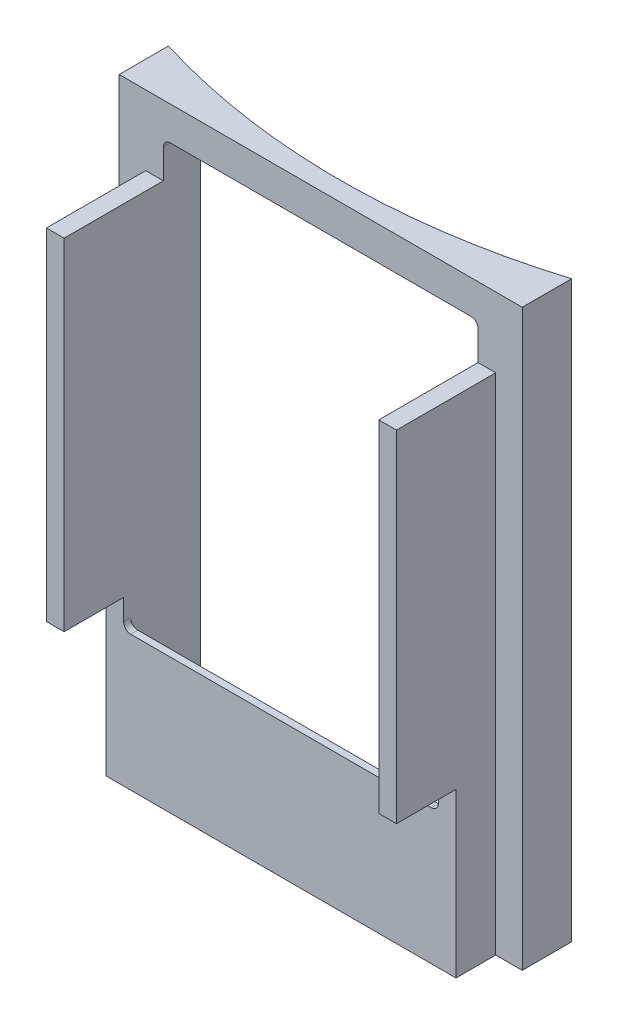
ISO-10303-21;
HEADER;
FILE_DESCRIPTION(('STEP AP214'),'2;1');
FILE_NAME('part.step','',(''),(''),'','','');
FILE_SCHEMA(('AUTOMOTIVE_DESIGN { 1 0 10303 214 1 1 1 1 }'));
ENDSEC;
DATA;
#1=APPLICATION_CONTEXT('core data for automotive mechanical design processes');
#2=APPLICATION_PROTOCOL_DEFINITION('international standard','automotive_design',2000,#1);
#3=PRODUCT_CONTEXT('',#1,'mechanical');
#4=PRODUCT('Part','Part','',(#3));
#5=PRODUCT_RELATED_PRODUCT_CATEGORY('part','',(#4));
#6=PRODUCT_DEFINITION_FORMATION('','',#4);
#7=PRODUCT_DEFINITION_CONTEXT('part definition',#1,'design');
#8=PRODUCT_DEFINITION('design','',#6,#7);
#9=PRODUCT_DEFINITION_SHAPE('','',#8);
#10=(LENGTH_UNIT() NAMED_UNIT(*) SI_UNIT(.MILLI.,.METRE.));
#11=(NAMED_UNIT(*) PLANE_ANGLE_UNIT() SI_UNIT($,.RADIAN.));
#12=(NAMED_UNIT(*) SI_UNIT($,.STERADIAN.) SOLID_ANGLE_UNIT());
#13=UNCERTAINTY_MEASURE_WITH_UNIT(LENGTH_MEASURE(1.E-05),#10,'distance_accuracy_value','');
#14=(GEOMETRIC_REPRESENTATION_CONTEXT(3) GLOBAL_UNCERTAINTY_ASSIGNED_CONTEXT((#13)) GLOBAL_UNIT_ASSIGNED_CONTEXT((#10,
#11,#12)) REPRESENTATION_CONTEXT('',''));
#15=CARTESIAN_POINT('',(0.,0.,0.));
#16=DIRECTION('',(0.,0.,1.));
#17=DIRECTION('',(1.,0.,0.));
#18=AXIS2_PLACEMENT_3D('',#15,#16,#17);
#19=CARTESIAN_POINT('',(-37.465,-119.888,288.06938));
#20=DIRECTION('',(0.,0.,1.));
#21=DIRECTION('',(1.,0.,0.));
#22=AXIS2_PLACEMENT_3D('',#19,#20,#21);
#23=PLANE('',#22);
#24=DIRECTION('',(0.,-1.,0.));
#25=VECTOR('',#24,1.);
#26=CARTESIAN_POINT('',(-37.465,76.835,288.06938));
#27=LINE('',#26,#25);
#28=CARTESIAN_POINT('',(-37.465,61.211000006,288.06938));
#29=VERTEX_POINT('',#28);
#30=CARTESIAN_POINT('',(-37.465,-61.211000006,288.06938));
#31=VERTEX_POINT('',#30);
#32=EDGE_CURVE('E510',#29,#31,#27,.T.);
#33=ORIENTED_EDGE('',*,*,#32,.T.);
#34=DIRECTION('',(1.,0.,0.));
#35=VECTOR('',#34,1.);
#36=CARTESIAN_POINT('',(-37.465,-61.211000006,288.06938));
#37=LINE('',#36,#35);
#38=CARTESIAN_POINT('',(-31.115,-61.211000006,288.06938));
#39=VERTEX_POINT('',#38);
#40=EDGE_CURVE('E225',#31,#39,#37,.T.);
#41=ORIENTED_EDGE('',*,*,#40,.T.);
#42=DIRECTION('',(0.,1.,0.));
#43=VECTOR('',#42,1.);
#44=CARTESIAN_POINT('',(-31.115,-119.888,288.06938));
#45=LINE('',#44,#43);
#46=CARTESIAN_POINT('',(-31.115,61.211000006,288.06938));
#47=VERTEX_POINT('',#46);
#48=EDGE_CURVE('E410',#39,#47,#45,.T.);
#49=ORIENTED_EDGE('',*,*,#48,.T.);
#50=DIRECTION('',(1.,0.,0.));
#51=VECTOR('',#50,1.);
#52=CARTESIAN_POINT('',(-37.465,61.211000006,288.06938));
#53=LINE('',#52,#51);
#54=EDGE_CURVE('E270',#29,#47,#53,.T.);
#55=ORIENTED_EDGE('',*,*,#54,.F.);
#56=EDGE_LOOP('',(#33,#41,#49,#55));
#57=FACE_BOUND('',#56,.T.);
#58=ADVANCED_FACE('F35',(#57),#23,.T.);
#59=DIRECTION('',(0.,-1.,0.));
#60=VECTOR('',#59,1.);
#61=CARTESIAN_POINT('',(81.9149999999999,-119.888,288.06938));
#62=LINE('',#61,#60);
#63=CARTESIAN_POINT('',(81.915,61.211000006,288.06938));
#64=VERTEX_POINT('',#63);
#65=CARTESIAN_POINT('',(81.915,-61.211000006,288.06938));
#66=VERTEX_POINT('',#65);
#67=EDGE_CURVE('E482',#64,#66,#62,.T.);
#68=ORIENTED_EDGE('',*,*,#67,.T.);
#69=CARTESIAN_POINT('',(88.265,-61.211000006,288.06938));
#70=VERTEX_POINT('',#69);
#71=EDGE_CURVE('E246',#66,#70,#37,.T.);
#72=ORIENTED_EDGE('',*,*,#71,.T.);
#73=DIRECTION('',(0.,1.,0.));
#74=VECTOR('',#73,1.);
#75=CARTESIAN_POINT('',(88.265,76.835,288.06938));
#76=LINE('',#75,#74);
#77=CARTESIAN_POINT('',(88.265,61.211000006,288.06938));
#78=VERTEX_POINT('',#77);
#79=EDGE_CURVE('E462',#70,#78,#76,.T.);
#80=ORIENTED_EDGE('',*,*,#79,.T.);
#81=EDGE_CURVE('E266',#64,#78,#53,.T.);
#82=ORIENTED_EDGE('',*,*,#81,.F.);
#83=EDGE_LOOP('',(#68,#72,#80,#82));
#84=FACE_BOUND('',#83,.T.);
#85=ADVANCED_FACE('F371',(#84),#23,.T.);
#86=CARTESIAN_POINT('',(-31.115,-71.374,294.5052));
#87=DIRECTION('',(0.,1.,0.));
#88=DIRECTION('',(0.,0.,1.));
#89=AXIS2_PLACEMENT_3D('',#86,#87,#88);
#90=PLANE('',#89);
#91=DIRECTION('',(-1.,0.,0.));
#92=VECTOR('',#91,1.);
#93=CARTESIAN_POINT('',(-31.115,-71.374,266.7));
#94=LINE('',#93,#92);
#95=CARTESIAN_POINT('',(79.375,-71.374,266.7));
#96=VERTEX_POINT('',#95);
#97=CARTESIAN_POINT('',(-28.575,-71.374,266.7));
#98=VERTEX_POINT('',#97);
#99=EDGE_CURVE('E239',#96,#98,#94,.T.);
#100=ORIENTED_EDGE('',*,*,#99,.F.);
#101=DIRECTION('',(0.,0.,-1.));
#102=VECTOR('',#101,1.);
#103=CARTESIAN_POINT('',(79.375,-71.374,264.16));
#104=LINE('',#103,#102);
#105=CARTESIAN_POINT('',(79.375,-71.374,264.16));
#106=VERTEX_POINT('',#105);
#107=EDGE_CURVE('E437',#96,#106,#104,.T.);
#108=ORIENTED_EDGE('',*,*,#107,.T.);
#109=DIRECTION('',(1.,0.,0.));
#110=VECTOR('',#109,1.);
#111=CARTESIAN_POINT('',(81.915,-71.374,264.16));
#112=LINE('',#111,#110);
#113=CARTESIAN_POINT('',(-28.575,-71.374,264.16));
#114=VERTEX_POINT('',#113);
#115=EDGE_CURVE('E458',#114,#106,#112,.T.);
#116=ORIENTED_EDGE('',*,*,#115,.F.);
#117=DIRECTION('',(0.,0.,-1.));
#118=VECTOR('',#117,1.);
#119=CARTESIAN_POINT('',(-28.575,-71.374,288.06938));
#120=LINE('',#119,#118);
#121=EDGE_CURVE('E434',#114,#98,#120,.F.);
#122=ORIENTED_EDGE('',*,*,#121,.T.);
#123=EDGE_LOOP('',(#100,#108,#116,#122));
#124=FACE_BOUND('',#123,.T.);
#125=ADVANCED_FACE('F346',(#124),#90,.T.);
#126=CARTESIAN_POINT('',(-46.99,86.36,252.4252));
#127=DIRECTION('',(1.,0.,0.));
#128=DIRECTION('',(0.,1.,0.));
#129=AXIS2_PLACEMENT_3D('',#126,#127,#128);
#130=PLANE('',#129);
#131=DIRECTION('',(0.,0.,-1.));
#132=VECTOR('',#131,1.);
#133=CARTESIAN_POINT('',(-46.99,86.36,252.4252));
#134=LINE('',#133,#132);
#135=CARTESIAN_POINT('',(-46.99,86.36,252.4252));
#136=VERTEX_POINT('',#135);
#137=CARTESIAN_POINT('',(-46.99,86.36,234.708094926443));
#138=VERTEX_POINT('',#137);
#139=EDGE_CURVE('E489',#136,#138,#134,.T.);
#140=ORIENTED_EDGE('',*,*,#139,.T.);
#141=DIRECTION('',(0.,1.,0.));
#142=VECTOR('',#141,1.);
#143=CARTESIAN_POINT('',(-46.99,-143.64,234.708094926443));
#144=LINE('',#143,#142);
#145=CARTESIAN_POINT('',(-46.99,-119.888,234.708094926443));
#146=VERTEX_POINT('',#145);
#147=EDGE_CURVE('E540',#138,#146,#144,.F.);
#148=ORIENTED_EDGE('',*,*,#147,.T.);
#149=DIRECTION('',(0.,0.,-1.));
#150=VECTOR('',#149,1.);
#151=CARTESIAN_POINT('',(-46.99,-119.888,252.4252));
#152=LINE('',#151,#150);
#153=CARTESIAN_POINT('',(-46.99,-119.888,252.4252));
#154=VERTEX_POINT('',#153);
#155=EDGE_CURVE('E479',#154,#146,#152,.T.);
#156=ORIENTED_EDGE('',*,*,#155,.F.);
#157=DIRECTION('',(0.,-1.,0.));
#158=VECTOR('',#157,1.);
#159=CARTESIAN_POINT('',(-46.99,86.36,252.4252));
#160=LINE('',#159,#158);
#161=EDGE_CURVE('E464',#136,#154,#160,.T.);
#162=ORIENTED_EDGE('',*,*,#161,.F.);
#163=EDGE_LOOP('',(#140,#148,#156,#162));
#164=FACE_BOUND('',#163,.T.);
#165=ADVANCED_FACE('F342',(#164),#130,.F.);
#166=CARTESIAN_POINT('',(-46.99,-119.888,252.4252));
#167=DIRECTION('',(0.,1.,0.));
#168=DIRECTION('',(0.,0.,1.));
#169=AXIS2_PLACEMENT_3D('',#166,#167,#168);
#170=PLANE('',#169);
#171=DIRECTION('',(0.,0.,-1.));
#172=VECTOR('',#171,1.);
#173=CARTESIAN_POINT('',(88.265,-119.888,288.06938));
#174=LINE('',#173,#172);
#175=CARTESIAN_POINT('',(88.265,-119.888,266.7));
#176=VERTEX_POINT('',#175);
#177=CARTESIAN_POINT('',(88.265,-119.888,252.4252));
#178=VERTEX_POINT('',#177);
#179=EDGE_CURVE('E508',#176,#178,#174,.T.);
#180=ORIENTED_EDGE('',*,*,#179,.F.);
#181=DIRECTION('',(1.,0.,0.));
#182=VECTOR('',#181,1.);
#183=CARTESIAN_POINT('',(-37.465,-119.888,266.7));
#184=LINE('',#183,#182);
#185=CARTESIAN_POINT('',(-37.465,-119.888,266.7));
#186=VERTEX_POINT('',#185);
#187=EDGE_CURVE('E58',#186,#176,#184,.T.);
#188=ORIENTED_EDGE('',*,*,#187,.F.);
#189=DIRECTION('',(0.,0.,-1.));
#190=VECTOR('',#189,1.);
#191=CARTESIAN_POINT('',(-37.465,-119.888,288.06938));
#192=LINE('',#191,#190);
#193=CARTESIAN_POINT('',(-37.465,-119.888,252.4252));
#194=VERTEX_POINT('',#193);
#195=EDGE_CURVE('E215',#186,#194,#192,.T.);
#196=ORIENTED_EDGE('',*,*,#195,.T.);
#197=DIRECTION('',(1.,0.,0.));
#198=VECTOR('',#197,1.);
#199=CARTESIAN_POINT('',(-46.99,-119.888,252.4252));
#200=LINE('',#199,#198);
#201=EDGE_CURVE('E476',#154,#194,#200,.T.);
#202=ORIENTED_EDGE('',*,*,#201,.F.);
#203=ORIENTED_EDGE('',*,*,#155,.T.);
#204=CARTESIAN_POINT('',(25.4,-119.888,0.));
#205=DIRECTION('',(0.,1.,0.));
#206=DIRECTION('',(0.,0.,1.));
#207=AXIS2_PLACEMENT_3D('',#204,#205,#206);
#208=CIRCLE('',#207,245.618);
#209=CARTESIAN_POINT('',(97.79,-119.888,234.708094926443));
#210=VERTEX_POINT('',#209);
#211=EDGE_CURVE('E544',#146,#210,#208,.T.);
#212=ORIENTED_EDGE('',*,*,#211,.T.);
#213=DIRECTION('',(0.,0.,-1.));
#214=VECTOR('',#213,1.);
#215=CARTESIAN_POINT('',(97.79,-119.888,252.4252));
#216=LINE('',#215,#214);
#217=CARTESIAN_POINT('',(97.79,-119.888,252.4252));
#218=VERTEX_POINT('',#217);
#219=EDGE_CURVE('E483',#218,#210,#216,.T.);
#220=ORIENTED_EDGE('',*,*,#219,.F.);
#221=EDGE_CURVE('E467',#178,#218,#200,.T.);
#222=ORIENTED_EDGE('',*,*,#221,.F.);
#223=EDGE_LOOP('',(#180,#188,#196,#202,#203,#212,#220,#222));
#224=FACE_BOUND('',#223,.T.);
#225=ADVANCED_FACE('F345',(#224),#170,.F.);
#226=CARTESIAN_POINT('',(97.79,86.36,252.4252));
#227=DIRECTION('',(-1.,0.,0.));
#228=DIRECTION('',(0.,-1.,0.));
#229=AXIS2_PLACEMENT_3D('',#226,#227,#228);
#230=PLANE('',#229);
#231=ORIENTED_EDGE('',*,*,#219,.T.);
#232=DIRECTION('',(0.,1.,0.));
#233=VECTOR('',#232,1.);
#234=CARTESIAN_POINT('',(97.79,-143.64,234.708094926443));
#235=LINE('',#234,#233);
#236=CARTESIAN_POINT('',(97.79,86.36,234.708094926443));
#237=VERTEX_POINT('',#236);
#238=EDGE_CURVE('E330',#210,#237,#235,.T.);
#239=ORIENTED_EDGE('',*,*,#238,.T.);
#240=DIRECTION('',(0.,0.,-1.));
#241=VECTOR('',#240,1.);
#242=CARTESIAN_POINT('',(97.79,86.36,252.4252));
#243=LINE('',#242,#241);
#244=CARTESIAN_POINT('',(97.79,86.36,252.4252));
#245=VERTEX_POINT('',#244);
#246=EDGE_CURVE('E486',#245,#237,#243,.T.);
#247=ORIENTED_EDGE('',*,*,#246,.F.);
#248=DIRECTION('',(0.,1.,0.));
#249=VECTOR('',#248,1.);
#250=CARTESIAN_POINT('',(97.79,86.36,252.4252));
#251=LINE('',#250,#249);
#252=EDGE_CURVE('E470',#218,#245,#251,.T.);
#253=ORIENTED_EDGE('',*,*,#252,.F.);
#254=EDGE_LOOP('',(#231,#239,#247,#253));
#255=FACE_BOUND('',#254,.T.);
#256=ADVANCED_FACE('F350',(#255),#230,.F.);
#257=CARTESIAN_POINT('',(-46.99,86.36,252.4252));
#258=DIRECTION('',(0.,-1.,0.));
#259=DIRECTION('',(0.,0.,-1.));
#260=AXIS2_PLACEMENT_3D('',#257,#258,#259);
#261=PLANE('',#260);
#262=ORIENTED_EDGE('',*,*,#246,.T.);
#263=CARTESIAN_POINT('',(25.4,86.36,0.));
#264=DIRECTION('',(0.,1.,0.));
#265=DIRECTION('',(0.,0.,1.));
#266=AXIS2_PLACEMENT_3D('',#263,#264,#265);
#267=CIRCLE('',#266,245.618);
#268=EDGE_CURVE('E277',#138,#237,#267,.T.);
#269=ORIENTED_EDGE('',*,*,#268,.F.);
#270=ORIENTED_EDGE('',*,*,#139,.F.);
#271=DIRECTION('',(-1.,0.,0.));
#272=VECTOR('',#271,1.);
#273=CARTESIAN_POINT('',(-46.99,86.36,252.4252));
#274=LINE('',#273,#272);
#275=EDGE_CURVE('E491',#245,#136,#274,.T.);
#276=ORIENTED_EDGE('',*,*,#275,.F.);
#277=EDGE_LOOP('',(#262,#269,#270,#276));
#278=FACE_BOUND('',#277,.T.);
#279=ADVANCED_FACE('F354',(#278),#261,.F.);
#280=CARTESIAN_POINT('',(-46.99,-119.888,252.4252));
#281=DIRECTION('',(0.,0.,1.));
#282=DIRECTION('',(1.,0.,0.));
#283=AXIS2_PLACEMENT_3D('',#280,#281,#282);
#284=PLANE('',#283);
#285=DIRECTION('',(0.,-1.,0.));
#286=VECTOR('',#285,1.);
#287=CARTESIAN_POINT('',(-37.465,76.835,252.4252));
#288=LINE('',#287,#286);
#289=CARTESIAN_POINT('',(-37.465,61.211000006,252.4252));
#290=VERTEX_POINT('',#289);
#291=EDGE_CURVE('E455',#290,#194,#288,.T.);
#292=ORIENTED_EDGE('',*,*,#291,.F.);
#293=DIRECTION('',(-1.,0.,0.));
#294=VECTOR('',#293,1.);
#295=CARTESIAN_POINT('',(-44.4776568299334,61.211000006,252.4252));
#296=LINE('',#295,#294);
#297=CARTESIAN_POINT('',(-31.115,61.211000006,252.4252));
#298=VERTEX_POINT('',#297);
#299=EDGE_CURVE('E254',#298,#290,#296,.T.);
#300=ORIENTED_EDGE('',*,*,#299,.F.);
#301=DIRECTION('',(0.,1.,0.));
#302=VECTOR('',#301,1.);
#303=CARTESIAN_POINT('',(-31.115,71.374,252.4252));
#304=LINE('',#303,#302);
#305=CARTESIAN_POINT('',(-31.115,71.755,252.4252));
#306=VERTEX_POINT('',#305);
#307=EDGE_CURVE('E264',#298,#306,#304,.T.);
#308=ORIENTED_EDGE('',*,*,#307,.T.);
#309=CARTESIAN_POINT('',(-28.575,71.755,252.4252));
#310=DIRECTION('',(0.,0.,-1.));
#311=DIRECTION('',(-1.,0.,0.));
#312=AXIS2_PLACEMENT_3D('',#309,#310,#311);
#313=CIRCLE('',#312,2.54);
#314=CARTESIAN_POINT('',(-28.575,74.295,252.4252));
#315=VERTEX_POINT('',#314);
#316=EDGE_CURVE('E261',#315,#306,#313,.F.);
#317=ORIENTED_EDGE('',*,*,#316,.F.);
#318=DIRECTION('',(-1.,0.,0.));
#319=VECTOR('',#318,1.);
#320=CARTESIAN_POINT('',(81.915,74.295,252.4252));
#321=LINE('',#320,#319);
#322=CARTESIAN_POINT('',(79.375,74.295,252.4252));
#323=VERTEX_POINT('',#322);
#324=EDGE_CURVE('E50',#323,#315,#321,.T.);
#325=ORIENTED_EDGE('',*,*,#324,.F.);
#326=CARTESIAN_POINT('',(79.375,71.755,252.4252));
#327=DIRECTION('',(0.,0.,-1.));
#328=DIRECTION('',(-1.,0.,0.));
#329=AXIS2_PLACEMENT_3D('',#326,#327,#328);
#330=CIRCLE('',#329,2.54);
#331=CARTESIAN_POINT('',(81.915,71.755,252.4252));
#332=VERTEX_POINT('',#331);
#333=EDGE_CURVE('E447',#332,#323,#330,.F.);
#334=ORIENTED_EDGE('',*,*,#333,.F.);
#335=DIRECTION('',(0.,-1.,0.));
#336=VECTOR('',#335,1.);
#337=CARTESIAN_POINT('',(81.915,71.374,252.4252));
#338=LINE('',#337,#336);
#339=CARTESIAN_POINT('',(81.915,61.211000006,252.4252));
#340=VERTEX_POINT('',#339);
#341=EDGE_CURVE('E259',#332,#340,#338,.T.);
#342=ORIENTED_EDGE('',*,*,#341,.T.);
#343=CARTESIAN_POINT('',(88.265,61.211000006,252.4252));
#344=VERTEX_POINT('',#343);
#345=EDGE_CURVE('E255',#344,#340,#296,.T.);
#346=ORIENTED_EDGE('',*,*,#345,.F.);
#347=DIRECTION('',(0.,1.,0.));
#348=VECTOR('',#347,1.);
#349=CARTESIAN_POINT('',(88.265,76.835,252.4252));
#350=LINE('',#349,#348);
#351=EDGE_CURVE('E457',#178,#344,#350,.T.);
#352=ORIENTED_EDGE('',*,*,#351,.F.);
#353=ORIENTED_EDGE('',*,*,#221,.T.);
#354=ORIENTED_EDGE('',*,*,#252,.T.);
#355=ORIENTED_EDGE('',*,*,#275,.T.);
#356=ORIENTED_EDGE('',*,*,#161,.T.);
#357=ORIENTED_EDGE('',*,*,#201,.T.);
#358=EDGE_LOOP('',(#292,#300,#308,#317,#325,#334,#342,#346,#352,#353,#354,#355,#356,#357));
#359=FACE_BOUND('',#358,.T.);
#360=ADVANCED_FACE('F358',(#359),#284,.T.);
#361=CARTESIAN_POINT('',(-37.465,76.835,288.06938));
#362=DIRECTION('',(1.,0.,0.));
#363=DIRECTION('',(0.,1.,0.));
#364=AXIS2_PLACEMENT_3D('',#361,#362,#363);
#365=PLANE('',#364);
#366=DIRECTION('',(0.,-1.,0.));
#367=VECTOR('',#366,1.);
#368=CARTESIAN_POINT('',(-37.465,-119.888,266.7));
#369=LINE('',#368,#367);
#370=CARTESIAN_POINT('',(-37.465,-61.211000006,266.7));
#371=VERTEX_POINT('',#370);
#372=EDGE_CURVE('E208',#371,#186,#369,.T.);
#373=ORIENTED_EDGE('',*,*,#372,.F.);
#374=DIRECTION('',(0.,0.,-1.));
#375=VECTOR('',#374,1.);
#376=CARTESIAN_POINT('',(-37.465,-61.211000006,288.06938));
#377=LINE('',#376,#375);
#378=EDGE_CURVE('E212',#31,#371,#377,.T.);
#379=ORIENTED_EDGE('',*,*,#378,.F.);
#380=ORIENTED_EDGE('',*,*,#32,.F.);
#381=DIRECTION('',(0.,0.,-1.));
#382=VECTOR('',#381,1.);
#383=CARTESIAN_POINT('',(-37.465,61.211000006,288.06938));
#384=LINE('',#383,#382);
#385=EDGE_CURVE('E217',#29,#290,#384,.T.);
#386=ORIENTED_EDGE('',*,*,#385,.T.);
#387=ORIENTED_EDGE('',*,*,#291,.T.);
#388=ORIENTED_EDGE('',*,*,#195,.F.);
#389=EDGE_LOOP('',(#373,#379,#380,#386,#387,#388));
#390=FACE_BOUND('',#389,.T.);
#391=ADVANCED_FACE('F210',(#390),#365,.F.);
#392=CARTESIAN_POINT('',(88.265,76.835,288.06938));
#393=DIRECTION('',(-1.,0.,0.));
#394=DIRECTION('',(0.,-1.,0.));
#395=AXIS2_PLACEMENT_3D('',#392,#393,#394);
#396=PLANE('',#395);
#397=DIRECTION('',(0.,0.,1.));
#398=VECTOR('',#397,1.);
#399=CARTESIAN_POINT('',(88.265,-61.211000006,288.06938));
#400=LINE('',#399,#398);
#401=CARTESIAN_POINT('',(88.265,-61.211000006,266.7));
#402=VERTEX_POINT('',#401);
#403=EDGE_CURVE('E249',#402,#70,#400,.T.);
#404=ORIENTED_EDGE('',*,*,#403,.F.);
#405=DIRECTION('',(0.,1.,0.));
#406=VECTOR('',#405,1.);
#407=CARTESIAN_POINT('',(88.265,-119.888,266.7));
#408=LINE('',#407,#406);
#409=EDGE_CURVE('E275',#176,#402,#408,.T.);
#410=ORIENTED_EDGE('',*,*,#409,.F.);
#411=ORIENTED_EDGE('',*,*,#179,.T.);
#412=ORIENTED_EDGE('',*,*,#351,.T.);
#413=DIRECTION('',(0.,0.,-1.));
#414=VECTOR('',#413,1.);
#415=CARTESIAN_POINT('',(88.265,61.211000006,292.15726668321));
#416=LINE('',#415,#414);
#417=EDGE_CURVE('E226',#78,#344,#416,.T.);
#418=ORIENTED_EDGE('',*,*,#417,.F.);
#419=ORIENTED_EDGE('',*,*,#79,.F.);
#420=EDGE_LOOP('',(#404,#410,#411,#412,#418,#419));
#421=FACE_BOUND('',#420,.T.);
#422=ADVANCED_FACE('F364',(#421),#396,.F.);
#423=CARTESIAN_POINT('',(-31.115,71.374,294.5052));
#424=DIRECTION('',(1.,0.,0.));
#425=DIRECTION('',(0.,1.,0.));
#426=AXIS2_PLACEMENT_3D('',#423,#424,#425);
#427=PLANE('',#426);
#428=DIRECTION('',(0.,1.,0.));
#429=VECTOR('',#428,1.);
#430=CARTESIAN_POINT('',(-31.115,71.374,266.7));
#431=LINE('',#430,#429);
#432=CARTESIAN_POINT('',(-31.115,-68.834,266.7));
#433=VERTEX_POINT('',#432);
#434=CARTESIAN_POINT('',(-31.115,-61.211000006,266.7));
#435=VERTEX_POINT('',#434);
#436=EDGE_CURVE('E230',#433,#435,#431,.T.);
#437=ORIENTED_EDGE('',*,*,#436,.F.);
#438=DIRECTION('',(0.,0.,-1.));
#439=VECTOR('',#438,1.);
#440=CARTESIAN_POINT('',(-31.115,-68.834,264.16));
#441=LINE('',#440,#439);
#442=CARTESIAN_POINT('',(-31.115,-68.834,264.16));
#443=VERTEX_POINT('',#442);
#444=EDGE_CURVE('E421',#433,#443,#441,.T.);
#445=ORIENTED_EDGE('',*,*,#444,.T.);
#446=DIRECTION('',(0.,1.,0.));
#447=VECTOR('',#446,1.);
#448=CARTESIAN_POINT('',(-31.115,-71.374,264.16));
#449=LINE('',#448,#447);
#450=CARTESIAN_POINT('',(-31.115,-114.808,264.16));
#451=VERTEX_POINT('',#450);
#452=EDGE_CURVE('E542',#451,#443,#449,.T.);
#453=ORIENTED_EDGE('',*,*,#452,.F.);
#454=DIRECTION('',(0.,0.,-1.));
#455=VECTOR('',#454,1.);
#456=CARTESIAN_POINT('',(-31.115,-114.808,294.5052));
#457=LINE('',#456,#455);
#458=CARTESIAN_POINT('',(-31.115,-114.808,239.027732070988));
#459=VERTEX_POINT('',#458);
#460=EDGE_CURVE('E426',#451,#459,#457,.T.);
#461=ORIENTED_EDGE('',*,*,#460,.T.);
#462=DIRECTION('',(0.,1.,0.));
#463=VECTOR('',#462,1.);
#464=CARTESIAN_POINT('',(-31.115,-143.64,239.027732070988));
#465=LINE('',#464,#463);
#466=CARTESIAN_POINT('',(-31.115,71.755,239.027732070988));
#467=VERTEX_POINT('',#466);
#468=EDGE_CURVE('E331',#467,#459,#465,.F.);
#469=ORIENTED_EDGE('',*,*,#468,.F.);
#470=DIRECTION('',(0.,0.,-1.));
#471=VECTOR('',#470,1.);
#472=CARTESIAN_POINT('',(-31.115,71.755,294.5052));
#473=LINE('',#472,#471);
#474=EDGE_CURVE('E423',#467,#306,#473,.F.);
#475=ORIENTED_EDGE('',*,*,#474,.T.);
#476=ORIENTED_EDGE('',*,*,#307,.F.);
#477=DIRECTION('',(0.,0.,-1.));
#478=VECTOR('',#477,1.);
#479=CARTESIAN_POINT('',(-31.115,61.211000006,294.5052));
#480=LINE('',#479,#478);
#481=EDGE_CURVE('E269',#47,#298,#480,.T.);
#482=ORIENTED_EDGE('',*,*,#481,.F.);
#483=ORIENTED_EDGE('',*,*,#48,.F.);
#484=DIRECTION('',(0.,0.,-1.));
#485=VECTOR('',#484,1.);
#486=CARTESIAN_POINT('',(-31.115,-61.211000006,294.5052));
#487=LINE('',#486,#485);
#488=EDGE_CURVE('E251',#39,#435,#487,.T.);
#489=ORIENTED_EDGE('',*,*,#488,.T.);
#490=EDGE_LOOP('',(#437,#445,#453,#461,#469,#475,#476,#482,#483,#489));
#491=FACE_BOUND('',#490,.T.);
#492=ADVANCED_FACE('F367',(#491),#427,.T.);
#493=CARTESIAN_POINT('',(81.915,71.374,294.5052));
#494=DIRECTION('',(-1.,0.,0.));
#495=DIRECTION('',(0.,-1.,0.));
#496=AXIS2_PLACEMENT_3D('',#493,#494,#495);
#497=PLANE('',#496);
#498=DIRECTION('',(0.,-1.,0.));
#499=VECTOR('',#498,1.);
#500=CARTESIAN_POINT('',(81.915,71.374,266.7));
#501=LINE('',#500,#499);
#502=CARTESIAN_POINT('',(81.915,-61.211000006,266.7));
#503=VERTEX_POINT('',#502);
#504=CARTESIAN_POINT('',(81.915,-68.834,266.7));
#505=VERTEX_POINT('',#504);
#506=EDGE_CURVE('E244',#503,#505,#501,.T.);
#507=ORIENTED_EDGE('',*,*,#506,.F.);
#508=DIRECTION('',(0.,0.,1.));
#509=VECTOR('',#508,1.);
#510=CARTESIAN_POINT('',(81.915,-61.211000006,294.5052));
#511=LINE('',#510,#509);
#512=EDGE_CURVE('E11',#503,#66,#511,.T.);
#513=ORIENTED_EDGE('',*,*,#512,.T.);
#514=ORIENTED_EDGE('',*,*,#67,.F.);
#515=DIRECTION('',(0.,0.,1.));
#516=VECTOR('',#515,1.);
#517=CARTESIAN_POINT('',(81.915,61.211000006,294.5052));
#518=LINE('',#517,#516);
#519=EDGE_CURVE('E43',#340,#64,#518,.T.);
#520=ORIENTED_EDGE('',*,*,#519,.F.);
#521=ORIENTED_EDGE('',*,*,#341,.F.);
#522=DIRECTION('',(0.,0.,-1.));
#523=VECTOR('',#522,1.);
#524=CARTESIAN_POINT('',(81.915,71.755,294.5052));
#525=LINE('',#524,#523);
#526=CARTESIAN_POINT('',(81.915,71.755,239.027732070988));
#527=VERTEX_POINT('',#526);
#528=EDGE_CURVE('E408',#332,#527,#525,.T.);
#529=ORIENTED_EDGE('',*,*,#528,.T.);
#530=DIRECTION('',(0.,1.,0.));
#531=VECTOR('',#530,1.);
#532=CARTESIAN_POINT('',(81.9149999999999,-143.64,239.027732070988));
#533=LINE('',#532,#531);
#534=CARTESIAN_POINT('',(81.9149999999999,-114.808,239.027732070988));
#535=VERTEX_POINT('',#534);
#536=EDGE_CURVE('E282',#535,#527,#533,.T.);
#537=ORIENTED_EDGE('',*,*,#536,.F.);
#538=DIRECTION('',(0.,0.,-1.));
#539=VECTOR('',#538,1.);
#540=CARTESIAN_POINT('',(81.9149999999999,-114.808,294.5052));
#541=LINE('',#540,#539);
#542=CARTESIAN_POINT('',(81.915,-114.808,264.16));
#543=VERTEX_POINT('',#542);
#544=EDGE_CURVE('E415',#535,#543,#541,.F.);
#545=ORIENTED_EDGE('',*,*,#544,.T.);
#546=DIRECTION('',(0.,-1.,0.));
#547=VECTOR('',#546,1.);
#548=CARTESIAN_POINT('',(81.915,-71.374,264.16));
#549=LINE('',#548,#547);
#550=CARTESIAN_POINT('',(81.915,-68.834,264.16));
#551=VERTEX_POINT('',#550);
#552=EDGE_CURVE('E537',#551,#543,#549,.T.);
#553=ORIENTED_EDGE('',*,*,#552,.F.);
#554=DIRECTION('',(0.,0.,-1.));
#555=VECTOR('',#554,1.);
#556=CARTESIAN_POINT('',(81.915,-68.834,288.06938));
#557=LINE('',#556,#555);
#558=EDGE_CURVE('E404',#551,#505,#557,.F.);
#559=ORIENTED_EDGE('',*,*,#558,.T.);
#560=EDGE_LOOP('',(#507,#513,#514,#520,#521,#529,#537,#545,#553,#559));
#561=FACE_BOUND('',#560,.T.);
#562=ADVANCED_FACE('F375',(#561),#497,.T.);
#563=CARTESIAN_POINT('',(81.915,74.295,264.16));
#564=DIRECTION('',(0.,1.,0.));
#565=DIRECTION('',(0.,0.,1.));
#566=AXIS2_PLACEMENT_3D('',#563,#564,#565);
#567=PLANE('',#566);
#568=DIRECTION('',(0.,0.,-1.));
#569=VECTOR('',#568,1.);
#570=CARTESIAN_POINT('',(79.375,74.295,264.16));
#571=LINE('',#570,#569);
#572=CARTESIAN_POINT('',(79.375,74.295,239.614067406319));
#573=VERTEX_POINT('',#572);
#574=EDGE_CURVE('E429',#573,#323,#571,.F.);
#575=ORIENTED_EDGE('',*,*,#574,.T.);
#576=ORIENTED_EDGE('',*,*,#324,.T.);
#577=DIRECTION('',(0.,0.,-1.));
#578=VECTOR('',#577,1.);
#579=CARTESIAN_POINT('',(-28.575,74.295,264.16));
#580=LINE('',#579,#578);
#581=CARTESIAN_POINT('',(-28.575,74.295,239.614067406319));
#582=VERTEX_POINT('',#581);
#583=EDGE_CURVE('E432',#315,#582,#580,.T.);
#584=ORIENTED_EDGE('',*,*,#583,.T.);
#585=CARTESIAN_POINT('',(25.4,74.295,0.));
#586=DIRECTION('',(0.,1.,0.));
#587=DIRECTION('',(0.,0.,1.));
#588=AXIS2_PLACEMENT_3D('',#585,#586,#587);
#589=CIRCLE('',#588,245.618);
#590=EDGE_CURVE('E279',#582,#573,#589,.T.);
#591=ORIENTED_EDGE('',*,*,#590,.T.);
#592=EDGE_LOOP('',(#575,#576,#584,#591));
#593=FACE_BOUND('',#592,.T.);
#594=ADVANCED_FACE('F382',(#593),#567,.F.);
#595=CARTESIAN_POINT('',(81.915,-117.348,264.16));
#596=DIRECTION('',(0.,-1.,0.));
#597=DIRECTION('',(0.,0.,-1.));
#598=AXIS2_PLACEMENT_3D('',#595,#596,#597);
#599=PLANE('',#598);
#600=DIRECTION('',(0.,0.,-1.));
#601=VECTOR('',#600,1.);
#602=CARTESIAN_POINT('',(79.3749999999999,-117.348,264.16));
#603=LINE('',#602,#601);
#604=CARTESIAN_POINT('',(79.3749999999999,-117.348,264.16));
#605=VERTEX_POINT('',#604);
#606=CARTESIAN_POINT('',(79.3749999999999,-117.348,239.614067406319));
#607=VERTEX_POINT('',#606);
#608=EDGE_CURVE('E397',#605,#607,#603,.T.);
#609=ORIENTED_EDGE('',*,*,#608,.T.);
#610=CARTESIAN_POINT('',(25.4,-117.348,0.));
#611=DIRECTION('',(0.,-1.,0.));
#612=DIRECTION('',(0.,0.,-1.));
#613=AXIS2_PLACEMENT_3D('',#610,#611,#612);
#614=CIRCLE('',#613,245.618);
#615=CARTESIAN_POINT('',(-28.575,-117.348,239.614067406319));
#616=VERTEX_POINT('',#615);
#617=EDGE_CURVE('E398',#607,#616,#614,.T.);
#618=ORIENTED_EDGE('',*,*,#617,.T.);
#619=DIRECTION('',(0.,0.,-1.));
#620=VECTOR('',#619,1.);
#621=CARTESIAN_POINT('',(-28.575,-117.348,264.16));
#622=LINE('',#621,#620);
#623=CARTESIAN_POINT('',(-28.575,-117.348,264.16));
#624=VERTEX_POINT('',#623);
#625=EDGE_CURVE('E405',#616,#624,#622,.F.);
#626=ORIENTED_EDGE('',*,*,#625,.T.);
#627=DIRECTION('',(-1.,0.,0.));
#628=VECTOR('',#627,1.);
#629=CARTESIAN_POINT('',(81.915,-117.348,264.16));
#630=LINE('',#629,#628);
#631=EDGE_CURVE('E401',#605,#624,#630,.T.);
#632=ORIENTED_EDGE('',*,*,#631,.F.);
#633=EDGE_LOOP('',(#609,#618,#626,#632));
#634=FACE_BOUND('',#633,.T.);
#635=ADVANCED_FACE('F385',(#634),#599,.F.);
#636=CARTESIAN_POINT('',(81.915,-117.348,264.16));
#637=DIRECTION('',(0.,0.,-1.));
#638=DIRECTION('',(-1.,0.,0.));
#639=AXIS2_PLACEMENT_3D('',#636,#637,#638);
#640=PLANE('',#639);
#641=ORIENTED_EDGE('',*,*,#552,.T.);
#642=CARTESIAN_POINT('',(79.3749999999999,-114.808,264.16));
#643=DIRECTION('',(0.,0.,-1.));
#644=DIRECTION('',(-1.,0.,0.));
#645=AXIS2_PLACEMENT_3D('',#642,#643,#644);
#646=CIRCLE('',#645,2.54);
#647=EDGE_CURVE('E419',#543,#605,#646,.T.);
#648=ORIENTED_EDGE('',*,*,#647,.T.);
#649=ORIENTED_EDGE('',*,*,#631,.T.);
#650=CARTESIAN_POINT('',(-28.575,-114.808,264.16));
#651=DIRECTION('',(0.,0.,-1.));
#652=DIRECTION('',(-1.,0.,0.));
#653=AXIS2_PLACEMENT_3D('',#650,#651,#652);
#654=CIRCLE('',#653,2.54);
#655=EDGE_CURVE('E417',#624,#451,#654,.T.);
#656=ORIENTED_EDGE('',*,*,#655,.T.);
#657=ORIENTED_EDGE('',*,*,#452,.T.);
#658=CARTESIAN_POINT('',(-28.575,-68.834,264.16));
#659=DIRECTION('',(0.,0.,-1.));
#660=DIRECTION('',(-1.,0.,0.));
#661=AXIS2_PLACEMENT_3D('',#658,#659,#660);
#662=CIRCLE('',#661,2.54);
#663=EDGE_CURVE('E441',#443,#114,#662,.F.);
#664=ORIENTED_EDGE('',*,*,#663,.T.);
#665=ORIENTED_EDGE('',*,*,#115,.T.);
#666=CARTESIAN_POINT('',(79.375,-68.834,264.16));
#667=DIRECTION('',(0.,0.,-1.));
#668=DIRECTION('',(-1.,0.,0.));
#669=AXIS2_PLACEMENT_3D('',#666,#667,#668);
#670=CIRCLE('',#669,2.54);
#671=EDGE_CURVE('E439',#106,#551,#670,.F.);
#672=ORIENTED_EDGE('',*,*,#671,.T.);
#673=EDGE_LOOP('',(#641,#648,#649,#656,#657,#664,#665,#672));
#674=FACE_BOUND('',#673,.T.);
#675=ADVANCED_FACE('F310',(#674),#640,.T.);
#676=CARTESIAN_POINT('',(79.3749999999999,-114.808,264.16));
#677=DIRECTION('',(0.,0.,-1.));
#678=DIRECTION('',(-1.,0.,0.));
#679=AXIS2_PLACEMENT_3D('',#676,#677,#678);
#680=CYLINDRICAL_SURFACE('',#679,2.54);
#681=ORIENTED_EDGE('',*,*,#544,.F.);
#682=CARTESIAN_POINT('',(81.9149999999999,-114.808,239.027732070988));
#683=CARTESIAN_POINT('',(81.9150078401323,-114.878071116366,239.027729984671));
#684=CARTESIAN_POINT('',(81.9121005031187,-114.948138357617,239.028417613344));
#685=CARTESIAN_POINT('',(81.900515926027,-115.087760312895,239.031156314265));
#686=CARTESIAN_POINT('',(81.8918392865855,-115.157315079513,239.033207244581));
#687=CARTESIAN_POINT('',(81.8687940332775,-115.295317303396,239.038652433436));
#688=CARTESIAN_POINT('',(81.8544340779025,-115.363766280979,239.042044648531));
#689=CARTESIAN_POINT('',(81.8201550104162,-115.499158861599,239.050137711885));
#690=CARTESIAN_POINT('',(81.8002359058113,-115.566102466669,239.054838558378));
#691=CARTESIAN_POINT('',(81.7323445423015,-115.763997222989,239.070849492913));
#692=CARTESIAN_POINT('',(81.6762221521579,-115.892107766828,239.084071786547));
#693=CARTESIAN_POINT('',(81.5440943962843,-116.136913153111,239.115133695432));
#694=CARTESIAN_POINT('',(81.4680881371306,-116.253607482278,239.132973518157));
#695=CARTESIAN_POINT('',(81.2974596378412,-116.473948157595,239.172915853952));
#696=CARTESIAN_POINT('',(81.2026264934113,-116.577422578308,239.195066598109));
#697=CARTESIAN_POINT('',(80.9977152198725,-116.767054599632,239.242778437334));
#698=CARTESIAN_POINT('',(80.8876334203652,-116.853208018748,239.268340353427));
#699=CARTESIAN_POINT('',(80.6523769407203,-117.008054599818,239.322777208709));
#700=CARTESIAN_POINT('',(80.526890433342,-117.076249863292,239.351719698685));
#701=CARTESIAN_POINT('',(80.266678110958,-117.190580988315,239.411502129129));
#702=CARTESIAN_POINT('',(80.1319546076558,-117.236722346324,239.44234159465));
#703=CARTESIAN_POINT('',(79.8931932241276,-117.296774848863,239.496773694212));
#704=CARTESIAN_POINT('',(79.7903980191313,-117.315969858064,239.520140382214));
#705=CARTESIAN_POINT('',(79.5834184278093,-117.341582780148,239.567048006027));
#706=CARTESIAN_POINT('',(79.479236149812,-117.348018254598,239.59058865752));
#707=CARTESIAN_POINT('',(79.375,-117.348,239.614067406319));
#708=B_SPLINE_CURVE_WITH_KNOTS('',3,(#682,#683,#684,#685,#686,#687,#688,#689,#690,#691,#692,
#693,#694,#695,#696,#697,#698,#699,#700,#701,#702,#703,#704,#705,#706,#707),.UNSPECIFIED.,.F.,
.F.,(4,2,2,2,2,2,2,2,2,2,2,2,4),(0.,0.210142866599182,0.420263858850156,0.630065957970033,
0.839867773804369,1.25918445264667,1.67851997549746,2.1028490185001,2.52728037687312,
2.96246945307255,3.39755001113602,3.71826609025349,4.03854044498907),.UNSPECIFIED.);
#709=EDGE_CURVE('E293',#535,#607,#708,.T.);
#710=ORIENTED_EDGE('',*,*,#709,.T.);
#711=ORIENTED_EDGE('',*,*,#608,.F.);
#712=ORIENTED_EDGE('',*,*,#647,.F.);
#713=EDGE_LOOP('',(#681,#710,#711,#712));
#714=FACE_BOUND('',#713,.T.);
#715=ADVANCED_FACE('F336',(#714),#680,.F.);
#716=CARTESIAN_POINT('',(-28.575,-114.808,294.5052));
#717=DIRECTION('',(0.,0.,-1.));
#718=DIRECTION('',(-1.,0.,0.));
#719=AXIS2_PLACEMENT_3D('',#716,#717,#718);
#720=CYLINDRICAL_SURFACE('',#719,2.54);
#721=ORIENTED_EDGE('',*,*,#625,.F.);
#722=CARTESIAN_POINT('',(-28.575,-117.348,239.614067406319));
#723=CARTESIAN_POINT('',(-28.6478994616668,-117.347998520554,239.597646407321));
#724=CARTESIAN_POINT('',(-28.7207565371371,-117.34485975544,239.581199570577));
#725=CARTESIAN_POINT('',(-28.8659423622539,-117.332335169789,239.54835618412));
#726=CARTESIAN_POINT('',(-28.9382711162887,-117.3229494012,239.53195963399));
#727=CARTESIAN_POINT('',(-29.1536631840849,-117.285486824327,239.483029341548));
#728=CARTESIAN_POINT('',(-29.2952742526936,-117.248104624811,239.450722974359));
#729=CARTESIAN_POINT('',(-29.5703297948755,-117.149433077599,239.387728891162));
#730=CARTESIAN_POINT('',(-29.7037686641211,-117.088127531533,239.357042287903));
#731=CARTESIAN_POINT('',(-29.9585087324269,-116.943171133037,239.298254317564));
#732=CARTESIAN_POINT('',(-30.0798142630321,-116.859528294332,239.270152028188));
#733=CARTESIAN_POINT('',(-30.3053675522316,-116.673103041137,239.217740234066));
#734=CARTESIAN_POINT('',(-30.4097854068687,-116.570537120897,239.193393040424));
#735=CARTESIAN_POINT('',(-30.599856293104,-116.348426085842,239.148965233368));
#736=CARTESIAN_POINT('',(-30.6855069377649,-116.22887881441,239.128885162685));
#737=CARTESIAN_POINT('',(-30.8333288406742,-115.979356911458,239.094166171868));
#738=CARTESIAN_POINT('',(-30.8960218750807,-115.849707773429,239.079406472097));
#739=CARTESIAN_POINT('',(-30.998676068266,-115.581296774452,239.055211341629));
#740=CARTESIAN_POINT('',(-31.038659464818,-115.442543977083,239.045770702465));
#741=CARTESIAN_POINT('',(-31.0827028960311,-115.220192007575,239.035366540452));
#742=CARTESIAN_POINT('',(-31.0948075938432,-115.13819020916,239.032505637247));
#743=CARTESIAN_POINT('',(-31.110953335273,-114.973472413664,239.028688869626));
#744=CARTESIAN_POINT('',(-31.1150059773063,-114.890757616472,239.027730265085));
#745=CARTESIAN_POINT('',(-31.115,-114.808,239.027732070988));
#746=B_SPLINE_CURVE_WITH_KNOTS('',3,(#722,#723,#724,#725,#726,#727,#728,#729,#730,#731,#732,
#733,#734,#735,#736,#737,#738,#739,#740,#741,#742,#743,#744,#745),.UNSPECIFIED.,.F.,.F.,(4,2,2,
2,2,2,2,2,2,2,2,4),(0.,0.224041260907126,0.448080658742489,0.895728435625518,1.34367983980527,
1.79147075235554,2.23442486606386,2.67743528492839,3.10963918540416,3.54141912948005,
3.78986163935753,4.03794602521939),.UNSPECIFIED.);
#747=EDGE_CURVE('E323',#616,#459,#746,.T.);
#748=ORIENTED_EDGE('',*,*,#747,.T.);
#749=ORIENTED_EDGE('',*,*,#460,.F.);
#750=ORIENTED_EDGE('',*,*,#655,.F.);
#751=EDGE_LOOP('',(#721,#748,#749,#750));
#752=FACE_BOUND('',#751,.T.);
#753=ADVANCED_FACE('F333',(#752),#720,.F.);
#754=CARTESIAN_POINT('',(-28.575,71.755,264.16));
#755=DIRECTION('',(0.,0.,-1.));
#756=DIRECTION('',(-1.,0.,0.));
#757=AXIS2_PLACEMENT_3D('',#754,#755,#756);
#758=CYLINDRICAL_SURFACE('',#757,2.54);
#759=ORIENTED_EDGE('',*,*,#583,.F.);
#760=ORIENTED_EDGE('',*,*,#316,.T.);
#761=ORIENTED_EDGE('',*,*,#474,.F.);
#762=CARTESIAN_POINT('',(-31.115,71.755,239.027732070988));
#763=CARTESIAN_POINT('',(-31.1150078401323,71.8250711163655,239.027729984671));
#764=CARTESIAN_POINT('',(-31.1121005031187,71.8951383576167,239.028417613344));
#765=CARTESIAN_POINT('',(-31.100515926027,72.0347603128949,239.031156314265));
#766=CARTESIAN_POINT('',(-31.0918392865855,72.1043150795131,239.033207244581));
#767=CARTESIAN_POINT('',(-31.0687940332776,72.2423173033961,239.038652433436));
#768=CARTESIAN_POINT('',(-31.0544340779025,72.3107662809789,239.042044648531));
#769=CARTESIAN_POINT('',(-31.0201550104163,72.446158861599,239.050137711885));
#770=CARTESIAN_POINT('',(-31.0002359058114,72.5131024666688,239.054838558378));
#771=CARTESIAN_POINT('',(-30.9323445423016,72.7109972229889,239.070849492913));
#772=CARTESIAN_POINT('',(-30.876222152158,72.8391077668276,239.084071786547));
#773=CARTESIAN_POINT('',(-30.7440943962843,73.0839131531114,239.115133695432));
#774=CARTESIAN_POINT('',(-30.6680881371307,73.2006074822784,239.132973518157));
#775=CARTESIAN_POINT('',(-30.4974596378413,73.4209481575953,239.172915853952));
#776=CARTESIAN_POINT('',(-30.4026264934114,73.5244225783079,239.195066598109));
#777=CARTESIAN_POINT('',(-30.1977152198726,73.7140545996315,239.242778437334));
#778=CARTESIAN_POINT('',(-30.0876334203652,73.8002080187479,239.268340353427));
#779=CARTESIAN_POINT('',(-29.8523769407204,73.9550545998178,239.322777208709));
#780=CARTESIAN_POINT('',(-29.726890433342,74.0232498632923,239.351719698685));
#781=CARTESIAN_POINT('',(-29.466678110958,74.137580988315,239.411502129129));
#782=CARTESIAN_POINT('',(-29.3319546076558,74.1837223463242,239.44234159465));
#783=CARTESIAN_POINT('',(-29.0931932241276,74.2437748488626,239.496773694212));
#784=CARTESIAN_POINT('',(-28.9903980191314,74.2629698580635,239.520140382214));
#785=CARTESIAN_POINT('',(-28.7834184278093,74.2885827801478,239.567048006027));
#786=CARTESIAN_POINT('',(-28.679236149812,74.2950182545981,239.59058865752));
#787=CARTESIAN_POINT('',(-28.575,74.295,239.614067406319));
#788=B_SPLINE_CURVE_WITH_KNOTS('',3,(#762,#763,#764,#765,#766,#767,#768,#769,#770,#771,#772,
#773,#774,#775,#776,#777,#778,#779,#780,#781,#782,#783,#784,#785,#786,#787),.UNSPECIFIED.,.F.,
.F.,(4,2,2,2,2,2,2,2,2,2,2,2,4),(0.,0.210142866599182,0.420263858850156,0.630065957970034,
0.839867773804368,1.25918445264669,1.67851997549746,2.1028490185001,2.52728037687312,
2.96246945307255,3.39755001113602,3.71826609025351,4.03854044498909),.UNSPECIFIED.);
#789=EDGE_CURVE('E285',#467,#582,#788,.T.);
#790=ORIENTED_EDGE('',*,*,#789,.T.);
#791=EDGE_LOOP('',(#759,#760,#761,#790));
#792=FACE_BOUND('',#791,.T.);
#793=ADVANCED_FACE('F299',(#792),#758,.F.);
#794=CARTESIAN_POINT('',(79.375,71.755,294.5052));
#795=DIRECTION('',(0.,0.,-1.));
#796=DIRECTION('',(-1.,0.,0.));
#797=AXIS2_PLACEMENT_3D('',#794,#795,#796);
#798=CYLINDRICAL_SURFACE('',#797,2.54);
#799=ORIENTED_EDGE('',*,*,#528,.F.);
#800=ORIENTED_EDGE('',*,*,#333,.T.);
#801=ORIENTED_EDGE('',*,*,#574,.F.);
#802=CARTESIAN_POINT('',(79.375,74.295,239.614067406319));
#803=CARTESIAN_POINT('',(79.4478994616668,74.2949985205536,239.597646407321));
#804=CARTESIAN_POINT('',(79.5207565371371,74.2918597554402,239.581199570577));
#805=CARTESIAN_POINT('',(79.6659423622538,74.2793351697886,239.54835618412));
#806=CARTESIAN_POINT('',(79.7382711162887,74.2699494011996,239.53195963399));
#807=CARTESIAN_POINT('',(79.9536631840849,74.2324868243269,239.483029341548));
#808=CARTESIAN_POINT('',(80.0952742526936,74.1951046248108,239.450722974359));
#809=CARTESIAN_POINT('',(80.3703297948755,74.0964330775989,239.387728891162));
#810=CARTESIAN_POINT('',(80.5037686641211,74.0351275315333,239.357042287903));
#811=CARTESIAN_POINT('',(80.7585087324269,73.8901711330372,239.298254317564));
#812=CARTESIAN_POINT('',(80.879814263032,73.8065282943325,239.270152028188));
#813=CARTESIAN_POINT('',(81.1053675522316,73.6201030411365,239.217740234066));
#814=CARTESIAN_POINT('',(81.2097854068687,73.5175371208965,239.193393040424));
#815=CARTESIAN_POINT('',(81.399856293104,73.2954260858416,239.148965233368));
#816=CARTESIAN_POINT('',(81.485506937765,73.1758788144103,239.128885162685));
#817=CARTESIAN_POINT('',(81.6333288406742,72.9263569114583,239.094166171868));
#818=CARTESIAN_POINT('',(81.6960218750807,72.796707773429,239.079406472097));
#819=CARTESIAN_POINT('',(81.798676068266,72.5282967744522,239.055211341629));
#820=CARTESIAN_POINT('',(81.838659464818,72.389543977083,239.045770702465));
#821=CARTESIAN_POINT('',(81.8827028960311,72.167192007575,239.035366540452));
#822=CARTESIAN_POINT('',(81.8948075938432,72.0851902091602,239.032505637247));
#823=CARTESIAN_POINT('',(81.910953335273,71.9204724136644,239.028688869625));
#824=CARTESIAN_POINT('',(81.9150059773063,71.8377576164716,239.027730265084));
#825=CARTESIAN_POINT('',(81.915,71.755,239.027732070988));
#826=B_SPLINE_CURVE_WITH_KNOTS('',3,(#802,#803,#804,#805,#806,#807,#808,#809,#810,#811,#812,
#813,#814,#815,#816,#817,#818,#819,#820,#821,#822,#823,#824,#825),.UNSPECIFIED.,.F.,.F.,(4,2,2,
2,2,2,2,2,2,2,2,4),(0.,0.224041260907108,0.448080658742483,0.895728435625522,1.34367983980526,
1.79147075235555,2.23442486606386,2.67743528492839,3.10963918540418,3.54141912948008,
3.78986163935758,4.03794602521941),.UNSPECIFIED.);
#827=EDGE_CURVE('E315',#573,#527,#826,.T.);
#828=ORIENTED_EDGE('',*,*,#827,.T.);
#829=EDGE_LOOP('',(#799,#800,#801,#828));
#830=FACE_BOUND('',#829,.T.);
#831=ADVANCED_FACE('F574',(#830),#798,.F.);
#832=CARTESIAN_POINT('',(79.375,-68.834,294.5052));
#833=DIRECTION('',(0.,0.,1.));
#834=DIRECTION('',(1.,0.,0.));
#835=AXIS2_PLACEMENT_3D('',#832,#833,#834);
#836=CYLINDRICAL_SURFACE('',#835,2.54);
#837=ORIENTED_EDGE('',*,*,#107,.F.);
#838=CARTESIAN_POINT('',(79.375,-68.834,266.7));
#839=DIRECTION('',(0.,0.,-1.));
#840=DIRECTION('',(-1.,0.,0.));
#841=AXIS2_PLACEMENT_3D('',#838,#839,#840);
#842=CIRCLE('',#841,2.54);
#843=EDGE_CURVE('E241',#96,#505,#842,.F.);
#844=ORIENTED_EDGE('',*,*,#843,.T.);
#845=ORIENTED_EDGE('',*,*,#558,.F.);
#846=ORIENTED_EDGE('',*,*,#671,.F.);
#847=EDGE_LOOP('',(#837,#844,#845,#846));
#848=FACE_BOUND('',#847,.T.);
#849=ADVANCED_FACE('F563',(#848),#836,.F.);
#850=CARTESIAN_POINT('',(-28.575,-68.834,294.5052));
#851=DIRECTION('',(0.,0.,1.));
#852=DIRECTION('',(1.,0.,0.));
#853=AXIS2_PLACEMENT_3D('',#850,#851,#852);
#854=CYLINDRICAL_SURFACE('',#853,2.54);
#855=ORIENTED_EDGE('',*,*,#444,.F.);
#856=CARTESIAN_POINT('',(-28.575,-68.834,266.7));
#857=DIRECTION('',(0.,0.,-1.));
#858=DIRECTION('',(-1.,0.,0.));
#859=AXIS2_PLACEMENT_3D('',#856,#857,#858);
#860=CIRCLE('',#859,2.54);
#861=EDGE_CURVE('E231',#433,#98,#860,.F.);
#862=ORIENTED_EDGE('',*,*,#861,.T.);
#863=ORIENTED_EDGE('',*,*,#121,.F.);
#864=ORIENTED_EDGE('',*,*,#663,.F.);
#865=EDGE_LOOP('',(#855,#862,#863,#864));
#866=FACE_BOUND('',#865,.T.);
#867=ADVANCED_FACE('F37',(#866),#854,.F.);
#868=CARTESIAN_POINT('',(25.4,-143.64,0.));
#869=DIRECTION('',(0.,1.,0.));
#870=DIRECTION('',(0.,0.,1.));
#871=AXIS2_PLACEMENT_3D('',#868,#869,#870);
#872=CYLINDRICAL_SURFACE('',#871,245.618);
#873=ORIENTED_EDGE('',*,*,#617,.F.);
#874=ORIENTED_EDGE('',*,*,#709,.F.);
#875=ORIENTED_EDGE('',*,*,#536,.T.);
#876=ORIENTED_EDGE('',*,*,#827,.F.);
#877=ORIENTED_EDGE('',*,*,#590,.F.);
#878=ORIENTED_EDGE('',*,*,#789,.F.);
#879=ORIENTED_EDGE('',*,*,#468,.T.);
#880=ORIENTED_EDGE('',*,*,#747,.F.);
#881=EDGE_LOOP('',(#873,#874,#875,#876,#877,#878,#879,#880));
#882=FACE_BOUND('',#881,.T.);
#883=ORIENTED_EDGE('',*,*,#268,.T.);
#884=ORIENTED_EDGE('',*,*,#238,.F.);
#885=ORIENTED_EDGE('',*,*,#211,.F.);
#886=ORIENTED_EDGE('',*,*,#147,.F.);
#887=EDGE_LOOP('',(#883,#884,#885,#886));
#888=FACE_BOUND('',#887,.T.);
#889=ADVANCED_FACE('F303',(#882,#888),#872,.F.);
#890=CARTESIAN_POINT('',(-37.465,-76.835,266.7));
#891=DIRECTION('',(0.,0.,-1.));
#892=DIRECTION('',(-1.,0.,0.));
#893=AXIS2_PLACEMENT_3D('',#890,#891,#892);
#894=PLANE('',#893);
#895=ORIENTED_EDGE('',*,*,#372,.T.);
#896=ORIENTED_EDGE('',*,*,#187,.T.);
#897=ORIENTED_EDGE('',*,*,#409,.T.);
#898=DIRECTION('',(1.,0.,0.));
#899=VECTOR('',#898,1.);
#900=CARTESIAN_POINT('',(-46.3219348846895,-61.211000006,266.7));
#901=LINE('',#900,#899);
#902=EDGE_CURVE('E232',#503,#402,#901,.T.);
#903=ORIENTED_EDGE('',*,*,#902,.F.);
#904=ORIENTED_EDGE('',*,*,#506,.T.);
#905=ORIENTED_EDGE('',*,*,#843,.F.);
#906=ORIENTED_EDGE('',*,*,#99,.T.);
#907=ORIENTED_EDGE('',*,*,#861,.F.);
#908=ORIENTED_EDGE('',*,*,#436,.T.);
#909=EDGE_CURVE('E222',#371,#435,#901,.T.);
#910=ORIENTED_EDGE('',*,*,#909,.F.);
#911=EDGE_LOOP('',(#895,#896,#897,#903,#904,#905,#906,#907,#908,#910));
#912=FACE_BOUND('',#911,.T.);
#913=ADVANCED_FACE('F228',(#912),#894,.F.);
#914=CARTESIAN_POINT('',(0.,61.211000006,0.));
#915=DIRECTION('',(0.,-1.,0.));
#916=DIRECTION('',(1.,0.,0.));
#917=AXIS2_PLACEMENT_3D('',#914,#915,#916);
#918=PLANE('',#917);
#919=ORIENTED_EDGE('',*,*,#54,.T.);
#920=ORIENTED_EDGE('',*,*,#481,.T.);
#921=ORIENTED_EDGE('',*,*,#299,.T.);
#922=ORIENTED_EDGE('',*,*,#385,.F.);
#923=EDGE_LOOP('',(#919,#920,#921,#922));
#924=FACE_BOUND('',#923,.T.);
#925=ADVANCED_FACE('F523',(#924),#918,.F.);
#926=ORIENTED_EDGE('',*,*,#81,.T.);
#927=ORIENTED_EDGE('',*,*,#417,.T.);
#928=ORIENTED_EDGE('',*,*,#345,.T.);
#929=ORIENTED_EDGE('',*,*,#519,.T.);
#930=EDGE_LOOP('',(#926,#927,#928,#929));
#931=FACE_BOUND('',#930,.T.);
#932=ADVANCED_FACE('F554',(#931),#918,.F.);
#933=CARTESIAN_POINT('',(0.,-61.211000006,0.));
#934=DIRECTION('',(0.,-1.,0.));
#935=DIRECTION('',(0.,0.,-1.));
#936=AXIS2_PLACEMENT_3D('',#933,#934,#935);
#937=PLANE('',#936);
#938=ORIENTED_EDGE('',*,*,#378,.T.);
#939=ORIENTED_EDGE('',*,*,#909,.T.);
#940=ORIENTED_EDGE('',*,*,#488,.F.);
#941=ORIENTED_EDGE('',*,*,#40,.F.);
#942=EDGE_LOOP('',(#938,#939,#940,#941));
#943=FACE_BOUND('',#942,.T.);
#944=ADVANCED_FACE('F221',(#943),#937,.T.);
#945=ORIENTED_EDGE('',*,*,#403,.T.);
#946=ORIENTED_EDGE('',*,*,#71,.F.);
#947=ORIENTED_EDGE('',*,*,#512,.F.);
#948=ORIENTED_EDGE('',*,*,#902,.T.);
#949=EDGE_LOOP('',(#945,#946,#947,#948));
#950=FACE_BOUND('',#949,.T.);
#951=ADVANCED_FACE('F559',(#950),#937,.T.);
#952=CLOSED_SHELL('',(#58,#85,#125,#165,#225,#256,#279,#360,#391,#422,#492,#562,#594,#635,#675,
#715,#753,#793,#831,#849,#867,#889,#913,#925,#932,#944,#951));
#953=MANIFOLD_SOLID_BREP('B2',#952);
#954=ADVANCED_BREP_SHAPE_REPRESENTATION('',(#18,#953),#14);
#955=SHAPE_DEFINITION_REPRESENTATION(#9,#954);
ENDSEC;
END-ISO-10303-21;
